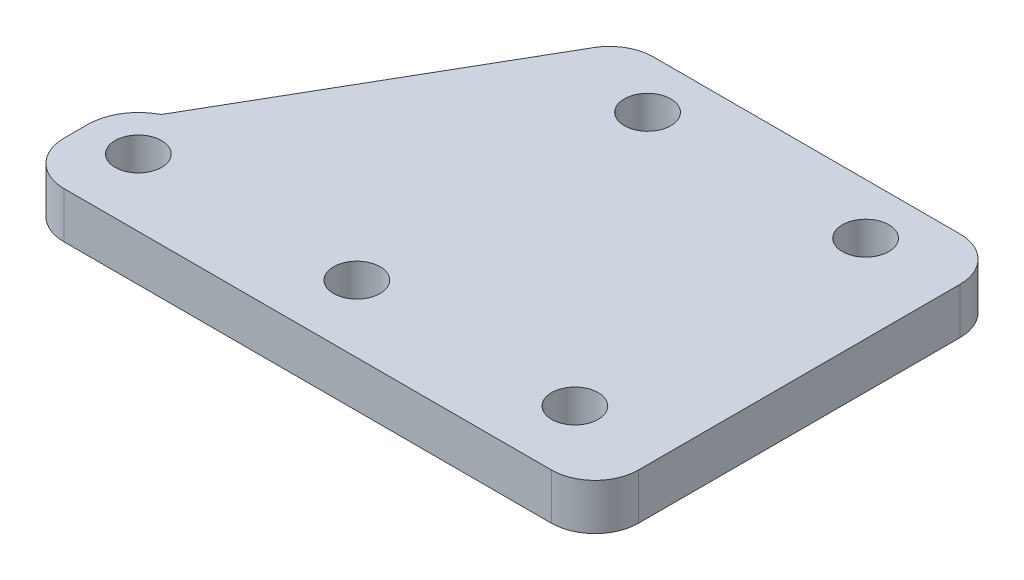
ISO-10303-21;
HEADER;
FILE_DESCRIPTION(('STEP AP214'),'2;1');
FILE_NAME('part.step','',(''),(''),'','','');
FILE_SCHEMA(('AUTOMOTIVE_DESIGN { 1 0 10303 214 1 1 1 1 }'));
ENDSEC;
DATA;
#1=APPLICATION_CONTEXT('core data for automotive mechanical design processes');
#2=APPLICATION_PROTOCOL_DEFINITION('international standard','automotive_design',2000,#1);
#3=PRODUCT_CONTEXT('',#1,'mechanical');
#4=PRODUCT('Part','Part','',(#3));
#5=PRODUCT_RELATED_PRODUCT_CATEGORY('part','',(#4));
#6=PRODUCT_DEFINITION_FORMATION('','',#4);
#7=PRODUCT_DEFINITION_CONTEXT('part definition',#1,'design');
#8=PRODUCT_DEFINITION('design','',#6,#7);
#9=PRODUCT_DEFINITION_SHAPE('','',#8);
#10=(LENGTH_UNIT() NAMED_UNIT(*) SI_UNIT(.MILLI.,.METRE.));
#11=(NAMED_UNIT(*) PLANE_ANGLE_UNIT() SI_UNIT($,.RADIAN.));
#12=(NAMED_UNIT(*) SI_UNIT($,.STERADIAN.) SOLID_ANGLE_UNIT());
#13=UNCERTAINTY_MEASURE_WITH_UNIT(LENGTH_MEASURE(1.E-05),#10,'distance_accuracy_value','');
#14=(GEOMETRIC_REPRESENTATION_CONTEXT(3) GLOBAL_UNCERTAINTY_ASSIGNED_CONTEXT((#13)) GLOBAL_UNIT_ASSIGNED_CONTEXT((#10,
#11,#12)) REPRESENTATION_CONTEXT('',''));
#15=CARTESIAN_POINT('',(0.,0.,0.));
#16=DIRECTION('',(0.,0.,1.));
#17=DIRECTION('',(1.,0.,0.));
#18=AXIS2_PLACEMENT_3D('',#15,#16,#17);
#19=CARTESIAN_POINT('',(-24.4672147191128,9.225,6.49807795643392));
#20=DIRECTION('',(0.,1.,0.));
#21=DIRECTION('',(0.,0.,1.));
#22=AXIS2_PLACEMENT_3D('',#19,#20,#21);
#23=PLANE('',#22);
#24=CARTESIAN_POINT('',(7.5,9.225,-10.));
#25=DIRECTION('',(0.,1.,0.));
#26=DIRECTION('',(0.,0.,1.));
#27=AXIS2_PLACEMENT_3D('',#24,#25,#26);
#28=CIRCLE('',#27,1.59999999999999);
#29=CARTESIAN_POINT('',(7.5,9.225,-8.40000000000001));
#30=VERTEX_POINT('',#29);
#31=EDGE_CURVE('E284',#30,#30,#28,.T.);
#32=ORIENTED_EDGE('',*,*,#31,.F.);
#33=EDGE_LOOP('',(#32));
#34=FACE_BOUND('',#33,.T.);
#35=CARTESIAN_POINT('',(-7.5,9.225,10.));
#36=DIRECTION('',(0.,1.,0.));
#37=DIRECTION('',(0.,0.,1.));
#38=AXIS2_PLACEMENT_3D('',#35,#36,#37);
#39=CIRCLE('',#38,1.59999999999999);
#40=CARTESIAN_POINT('',(-7.5,9.225,11.6));
#41=VERTEX_POINT('',#40);
#42=EDGE_CURVE('E296',#41,#41,#39,.T.);
#43=ORIENTED_EDGE('',*,*,#42,.F.);
#44=EDGE_LOOP('',(#43));
#45=FACE_BOUND('',#44,.T.);
#46=CARTESIAN_POINT('',(-24.4672147191128,9.225,6.49807795643392));
#47=DIRECTION('',(0.,-1.,0.));
#48=DIRECTION('',(0.,0.,1.));
#49=AXIS2_PLACEMENT_3D('',#46,#47,#48);
#50=CIRCLE('',#49,0.499999999999998);
#51=CARTESIAN_POINT('',(-24.0342020172206,9.225,6.74807795643392));
#52=VERTEX_POINT('',#51);
#53=CARTESIAN_POINT('',(-24.2255880054359,9.225,6.93581821187968));
#54=VERTEX_POINT('',#53);
#55=EDGE_CURVE('E172',#52,#54,#50,.T.);
#56=ORIENTED_EDGE('',*,*,#55,.T.);
#57=CARTESIAN_POINT('',(-22.5342010096979,9.225,10.));
#58=DIRECTION('',(0.,1.,0.));
#59=DIRECTION('',(0.,0.,1.));
#60=AXIS2_PLACEMENT_3D('',#57,#58,#59);
#61=CIRCLE('',#60,3.5);
#62=CARTESIAN_POINT('',(-26.0342010096979,9.225,10.));
#63=VERTEX_POINT('',#62);
#64=EDGE_CURVE('E105',#54,#63,#61,.T.);
#65=ORIENTED_EDGE('',*,*,#64,.T.);
#66=DIRECTION('',(0.,0.,1.));
#67=VECTOR('',#66,1.);
#68=CARTESIAN_POINT('',(-26.0342010096979,9.225,11.619));
#69=LINE('',#68,#67);
#70=CARTESIAN_POINT('',(-26.0342010096979,9.225,11.619));
#71=VERTEX_POINT('',#70);
#72=EDGE_CURVE('E196',#63,#71,#69,.T.);
#73=ORIENTED_EDGE('',*,*,#72,.T.);
#74=CARTESIAN_POINT('',(-23.0342010096979,9.225,11.619));
#75=DIRECTION('',(0.,1.,0.));
#76=DIRECTION('',(0.,0.,1.));
#77=AXIS2_PLACEMENT_3D('',#74,#75,#76);
#78=CIRCLE('',#77,3.);
#79=CARTESIAN_POINT('',(-23.0342010096979,9.225,14.619));
#80=VERTEX_POINT('',#79);
#81=EDGE_CURVE('E215',#71,#80,#78,.T.);
#82=ORIENTED_EDGE('',*,*,#81,.T.);
#83=DIRECTION('',(1.,0.,0.));
#84=VECTOR('',#83,1.);
#85=CARTESIAN_POINT('',(-23.0342010096979,9.225,14.619));
#86=LINE('',#85,#84);
#87=CARTESIAN_POINT('',(10.5,9.225,14.619));
#88=VERTEX_POINT('',#87);
#89=EDGE_CURVE('E212',#80,#88,#86,.T.);
#90=ORIENTED_EDGE('',*,*,#89,.T.);
#91=CARTESIAN_POINT('',(10.5,9.225,11.619));
#92=DIRECTION('',(0.,1.,0.));
#93=DIRECTION('',(0.,0.,1.));
#94=AXIS2_PLACEMENT_3D('',#91,#92,#93);
#95=CIRCLE('',#94,3.);
#96=CARTESIAN_POINT('',(13.5,9.225,11.619));
#97=VERTEX_POINT('',#96);
#98=EDGE_CURVE('E214',#88,#97,#95,.T.);
#99=ORIENTED_EDGE('',*,*,#98,.T.);
#100=DIRECTION('',(0.,0.,-1.));
#101=VECTOR('',#100,1.);
#102=CARTESIAN_POINT('',(13.5,9.225,11.619));
#103=LINE('',#102,#101);
#104=CARTESIAN_POINT('',(13.4999999999999,9.225,-10.5));
#105=VERTEX_POINT('',#104);
#106=EDGE_CURVE('E217',#97,#105,#103,.T.);
#107=ORIENTED_EDGE('',*,*,#106,.T.);
#108=CARTESIAN_POINT('',(10.5,9.225,-10.5));
#109=DIRECTION('',(0.,1.,0.));
#110=DIRECTION('',(0.,0.,1.));
#111=AXIS2_PLACEMENT_3D('',#108,#109,#110);
#112=CIRCLE('',#111,2.99999999999996);
#113=CARTESIAN_POINT('',(10.5,9.225,-13.5));
#114=VERTEX_POINT('',#113);
#115=EDGE_CURVE('E133',#105,#114,#112,.T.);
#116=ORIENTED_EDGE('',*,*,#115,.T.);
#117=DIRECTION('',(-1.,0.,0.));
#118=VECTOR('',#117,1.);
#119=CARTESIAN_POINT('',(10.5,9.225,-13.5));
#120=LINE('',#119,#118);
#121=CARTESIAN_POINT('',(-10.6119179509321,9.225,-13.5));
#122=VERTEX_POINT('',#121);
#123=EDGE_CURVE('E127',#114,#122,#120,.T.);
#124=ORIENTED_EDGE('',*,*,#123,.T.);
#125=CARTESIAN_POINT('',(-10.6119179509321,9.225,-10.5));
#126=DIRECTION('',(0.,1.,0.));
#127=DIRECTION('',(0.,0.,1.));
#128=AXIS2_PLACEMENT_3D('',#125,#126,#127);
#129=CIRCLE('',#128,3.);
#130=CARTESIAN_POINT('',(-13.2099941622855,9.225,-12.));
#131=VERTEX_POINT('',#130);
#132=EDGE_CURVE('E131',#122,#131,#129,.T.);
#133=ORIENTED_EDGE('',*,*,#132,.T.);
#134=DIRECTION('',(-0.499999999999997,0.,0.86602540378444));
#135=VECTOR('',#134,1.);
#136=CARTESIAN_POINT('',(-13.2099941622855,9.225,-12.));
#137=LINE('',#136,#135);
#138=EDGE_CURVE('E53',#131,#52,#137,.T.);
#139=ORIENTED_EDGE('',*,*,#138,.T.);
#140=EDGE_LOOP('',(#56,#65,#73,#82,#90,#99,#107,#116,#124,#133,#139));
#141=FACE_BOUND('',#140,.T.);
#142=CARTESIAN_POINT('',(-22.5342010096979,9.225,10.));
#143=DIRECTION('',(0.,1.,0.));
#144=DIRECTION('',(0.,0.,1.));
#145=AXIS2_PLACEMENT_3D('',#142,#143,#144);
#146=CIRCLE('',#145,1.59999999999999);
#147=CARTESIAN_POINT('',(-22.5342010096979,9.225,11.6));
#148=VERTEX_POINT('',#147);
#149=EDGE_CURVE('E155',#148,#148,#146,.T.);
#150=ORIENTED_EDGE('',*,*,#149,.F.);
#151=EDGE_LOOP('',(#150));
#152=FACE_BOUND('',#151,.T.);
#153=CARTESIAN_POINT('',(7.5,9.225,10.));
#154=DIRECTION('',(0.,1.,0.));
#155=DIRECTION('',(0.,0.,1.));
#156=AXIS2_PLACEMENT_3D('',#153,#154,#155);
#157=CIRCLE('',#156,1.59999999999999);
#158=CARTESIAN_POINT('',(7.5,9.225,11.6));
#159=VERTEX_POINT('',#158);
#160=EDGE_CURVE('E290',#159,#159,#157,.T.);
#161=ORIENTED_EDGE('',*,*,#160,.F.);
#162=EDGE_LOOP('',(#161));
#163=FACE_BOUND('',#162,.T.);
#164=CARTESIAN_POINT('',(-7.5,9.225,-10.));
#165=DIRECTION('',(0.,1.,0.));
#166=DIRECTION('',(0.,0.,1.));
#167=AXIS2_PLACEMENT_3D('',#164,#165,#166);
#168=CIRCLE('',#167,1.59999999999999);
#169=CARTESIAN_POINT('',(-7.5,9.225,-8.40000000000001));
#170=VERTEX_POINT('',#169);
#171=EDGE_CURVE('E275',#170,#170,#168,.T.);
#172=ORIENTED_EDGE('',*,*,#171,.F.);
#173=EDGE_LOOP('',(#172));
#174=FACE_BOUND('',#173,.T.);
#175=ADVANCED_FACE('F36',(#34,#45,#141,#152,#163,#174),#23,.T.);
#176=CARTESIAN_POINT('',(-24.4672147191128,6.05,6.49807795643392));
#177=DIRECTION('',(0.,1.,0.));
#178=DIRECTION('',(0.,0.,1.));
#179=AXIS2_PLACEMENT_3D('',#176,#177,#178);
#180=PLANE('',#179);
#181=CARTESIAN_POINT('',(-24.4672147191128,6.05,6.49807795643392));
#182=DIRECTION('',(0.,-1.,0.));
#183=DIRECTION('',(0.,0.,1.));
#184=AXIS2_PLACEMENT_3D('',#181,#182,#183);
#185=CIRCLE('',#184,0.499999999999998);
#186=CARTESIAN_POINT('',(-24.0342020172206,6.05,6.74807795643392));
#187=VERTEX_POINT('',#186);
#188=CARTESIAN_POINT('',(-24.2255880054359,6.05,6.93581821187968));
#189=VERTEX_POINT('',#188);
#190=EDGE_CURVE('E151',#187,#189,#185,.T.);
#191=ORIENTED_EDGE('',*,*,#190,.F.);
#192=DIRECTION('',(-0.499999999999997,0.,0.86602540378444));
#193=VECTOR('',#192,1.);
#194=CARTESIAN_POINT('',(-13.2099941622855,6.05,-12.));
#195=LINE('',#194,#193);
#196=CARTESIAN_POINT('',(-13.2099941622855,6.05,-12.));
#197=VERTEX_POINT('',#196);
#198=EDGE_CURVE('E97',#197,#187,#195,.T.);
#199=ORIENTED_EDGE('',*,*,#198,.F.);
#200=CARTESIAN_POINT('',(-10.6119179509321,6.05,-10.5));
#201=DIRECTION('',(0.,1.,0.));
#202=DIRECTION('',(0.,0.,1.));
#203=AXIS2_PLACEMENT_3D('',#200,#201,#202);
#204=CIRCLE('',#203,3.);
#205=CARTESIAN_POINT('',(-10.6119179509321,6.05,-13.5));
#206=VERTEX_POINT('',#205);
#207=EDGE_CURVE('E91',#206,#197,#204,.T.);
#208=ORIENTED_EDGE('',*,*,#207,.F.);
#209=DIRECTION('',(-1.,0.,0.));
#210=VECTOR('',#209,1.);
#211=CARTESIAN_POINT('',(10.5,6.05,-13.5));
#212=LINE('',#211,#210);
#213=CARTESIAN_POINT('',(10.5,6.05,-13.5));
#214=VERTEX_POINT('',#213);
#215=EDGE_CURVE('E141',#214,#206,#212,.T.);
#216=ORIENTED_EDGE('',*,*,#215,.F.);
#217=CARTESIAN_POINT('',(10.5,6.05,-10.5));
#218=DIRECTION('',(0.,1.,0.));
#219=DIRECTION('',(0.,0.,1.));
#220=AXIS2_PLACEMENT_3D('',#217,#218,#219);
#221=CIRCLE('',#220,2.99999999999996);
#222=CARTESIAN_POINT('',(13.4999999999999,6.05,-10.5));
#223=VERTEX_POINT('',#222);
#224=EDGE_CURVE('E167',#223,#214,#221,.T.);
#225=ORIENTED_EDGE('',*,*,#224,.F.);
#226=DIRECTION('',(0.,0.,-1.));
#227=VECTOR('',#226,1.);
#228=CARTESIAN_POINT('',(13.5,6.05,11.619));
#229=LINE('',#228,#227);
#230=CARTESIAN_POINT('',(13.5,6.05,11.619));
#231=VERTEX_POINT('',#230);
#232=EDGE_CURVE('E165',#231,#223,#229,.T.);
#233=ORIENTED_EDGE('',*,*,#232,.F.);
#234=CARTESIAN_POINT('',(10.5,6.05,11.619));
#235=DIRECTION('',(0.,1.,0.));
#236=DIRECTION('',(0.,0.,1.));
#237=AXIS2_PLACEMENT_3D('',#234,#235,#236);
#238=CIRCLE('',#237,3.);
#239=CARTESIAN_POINT('',(10.5,6.05,14.619));
#240=VERTEX_POINT('',#239);
#241=EDGE_CURVE('E163',#240,#231,#238,.T.);
#242=ORIENTED_EDGE('',*,*,#241,.F.);
#243=DIRECTION('',(1.,0.,0.));
#244=VECTOR('',#243,1.);
#245=CARTESIAN_POINT('',(-23.0342010096979,6.05,14.619));
#246=LINE('',#245,#244);
#247=CARTESIAN_POINT('',(-23.0342010096979,6.05,14.619));
#248=VERTEX_POINT('',#247);
#249=EDGE_CURVE('E161',#248,#240,#246,.T.);
#250=ORIENTED_EDGE('',*,*,#249,.F.);
#251=CARTESIAN_POINT('',(-23.0342010096979,6.05,11.619));
#252=DIRECTION('',(0.,1.,0.));
#253=DIRECTION('',(0.,0.,1.));
#254=AXIS2_PLACEMENT_3D('',#251,#252,#253);
#255=CIRCLE('',#254,3.);
#256=CARTESIAN_POINT('',(-26.0342010096979,6.05,11.619));
#257=VERTEX_POINT('',#256);
#258=EDGE_CURVE('E159',#257,#248,#255,.T.);
#259=ORIENTED_EDGE('',*,*,#258,.F.);
#260=DIRECTION('',(0.,0.,1.));
#261=VECTOR('',#260,1.);
#262=CARTESIAN_POINT('',(-26.0342010096979,6.05,11.619));
#263=LINE('',#262,#261);
#264=CARTESIAN_POINT('',(-26.0342010096979,6.05,10.));
#265=VERTEX_POINT('',#264);
#266=EDGE_CURVE('E157',#265,#257,#263,.T.);
#267=ORIENTED_EDGE('',*,*,#266,.F.);
#268=CARTESIAN_POINT('',(-22.5342010096979,6.05,10.));
#269=DIRECTION('',(0.,1.,0.));
#270=DIRECTION('',(0.,0.,1.));
#271=AXIS2_PLACEMENT_3D('',#268,#269,#270);
#272=CIRCLE('',#271,3.5);
#273=EDGE_CURVE('E154',#189,#265,#272,.T.);
#274=ORIENTED_EDGE('',*,*,#273,.F.);
#275=EDGE_LOOP('',(#191,#199,#208,#216,#225,#233,#242,#250,#259,#267,#274));
#276=FACE_BOUND('',#275,.T.);
#277=CARTESIAN_POINT('',(-22.5342010096979,6.05,10.));
#278=DIRECTION('',(0.,1.,0.));
#279=DIRECTION('',(0.,0.,1.));
#280=AXIS2_PLACEMENT_3D('',#277,#278,#279);
#281=CIRCLE('',#280,1.59999999999999);
#282=CARTESIAN_POINT('',(-22.5342010096979,6.05,11.6));
#283=VERTEX_POINT('',#282);
#284=EDGE_CURVE('E299',#283,#283,#281,.T.);
#285=ORIENTED_EDGE('',*,*,#284,.T.);
#286=EDGE_LOOP('',(#285));
#287=FACE_BOUND('',#286,.T.);
#288=CARTESIAN_POINT('',(-7.5,6.05,10.));
#289=DIRECTION('',(0.,1.,0.));
#290=DIRECTION('',(0.,0.,1.));
#291=AXIS2_PLACEMENT_3D('',#288,#289,#290);
#292=CIRCLE('',#291,1.59999999999999);
#293=CARTESIAN_POINT('',(-7.5,6.05,11.6));
#294=VERTEX_POINT('',#293);
#295=EDGE_CURVE('E293',#294,#294,#292,.T.);
#296=ORIENTED_EDGE('',*,*,#295,.T.);
#297=EDGE_LOOP('',(#296));
#298=FACE_BOUND('',#297,.T.);
#299=CARTESIAN_POINT('',(7.5,6.05,10.));
#300=DIRECTION('',(0.,1.,0.));
#301=DIRECTION('',(0.,0.,1.));
#302=AXIS2_PLACEMENT_3D('',#299,#300,#301);
#303=CIRCLE('',#302,1.59999999999999);
#304=CARTESIAN_POINT('',(7.5,6.05,11.6));
#305=VERTEX_POINT('',#304);
#306=EDGE_CURVE('E287',#305,#305,#303,.T.);
#307=ORIENTED_EDGE('',*,*,#306,.T.);
#308=EDGE_LOOP('',(#307));
#309=FACE_BOUND('',#308,.T.);
#310=CARTESIAN_POINT('',(7.5,6.05,-10.));
#311=DIRECTION('',(0.,1.,0.));
#312=DIRECTION('',(0.,0.,1.));
#313=AXIS2_PLACEMENT_3D('',#310,#311,#312);
#314=CIRCLE('',#313,1.59999999999999);
#315=CARTESIAN_POINT('',(7.5,6.05,-8.40000000000001));
#316=VERTEX_POINT('',#315);
#317=EDGE_CURVE('E281',#316,#316,#314,.T.);
#318=ORIENTED_EDGE('',*,*,#317,.T.);
#319=EDGE_LOOP('',(#318));
#320=FACE_BOUND('',#319,.T.);
#321=CARTESIAN_POINT('',(-7.5,6.05,-10.));
#322=DIRECTION('',(0.,1.,0.));
#323=DIRECTION('',(0.,0.,1.));
#324=AXIS2_PLACEMENT_3D('',#321,#322,#323);
#325=CIRCLE('',#324,1.59999999999999);
#326=CARTESIAN_POINT('',(-7.5,6.05,-8.40000000000001));
#327=VERTEX_POINT('',#326);
#328=EDGE_CURVE('E278',#327,#327,#325,.T.);
#329=ORIENTED_EDGE('',*,*,#328,.T.);
#330=EDGE_LOOP('',(#329));
#331=FACE_BOUND('',#330,.T.);
#332=ADVANCED_FACE('F200',(#276,#287,#298,#309,#320,#331),#180,.F.);
#333=CARTESIAN_POINT('',(-24.4672147191128,9.225,6.49807795643392));
#334=DIRECTION('',(0.,-1.,0.));
#335=DIRECTION('',(0.,0.,-1.));
#336=AXIS2_PLACEMENT_3D('',#333,#334,#335);
#337=CYLINDRICAL_SURFACE('',#336,0.499999999999998);
#338=ORIENTED_EDGE('',*,*,#190,.T.);
#339=DIRECTION('',(0.,-1.,0.));
#340=VECTOR('',#339,1.);
#341=CARTESIAN_POINT('',(-24.2255880054359,9.225,6.93581821187968));
#342=LINE('',#341,#340);
#343=EDGE_CURVE('E11',#54,#189,#342,.T.);
#344=ORIENTED_EDGE('',*,*,#343,.F.);
#345=ORIENTED_EDGE('',*,*,#55,.F.);
#346=DIRECTION('',(0.,-1.,0.));
#347=VECTOR('',#346,1.);
#348=CARTESIAN_POINT('',(-24.0342020172206,9.225,6.74807795643392));
#349=LINE('',#348,#347);
#350=EDGE_CURVE('E147',#52,#187,#349,.T.);
#351=ORIENTED_EDGE('',*,*,#350,.T.);
#352=EDGE_LOOP('',(#338,#344,#345,#351));
#353=FACE_BOUND('',#352,.T.);
#354=ADVANCED_FACE('F38',(#353),#337,.F.);
#355=CARTESIAN_POINT('',(-22.5342010096979,9.225,10.));
#356=DIRECTION('',(0.,-1.,0.));
#357=DIRECTION('',(0.,0.,-1.));
#358=AXIS2_PLACEMENT_3D('',#355,#356,#357);
#359=CYLINDRICAL_SURFACE('',#358,3.5);
#360=ORIENTED_EDGE('',*,*,#273,.T.);
#361=DIRECTION('',(0.,-1.,0.));
#362=VECTOR('',#361,1.);
#363=CARTESIAN_POINT('',(-26.0342010096979,9.225,10.));
#364=LINE('',#363,#362);
#365=EDGE_CURVE('E45',#63,#265,#364,.T.);
#366=ORIENTED_EDGE('',*,*,#365,.F.);
#367=ORIENTED_EDGE('',*,*,#64,.F.);
#368=ORIENTED_EDGE('',*,*,#343,.T.);
#369=EDGE_LOOP('',(#360,#366,#367,#368));
#370=FACE_BOUND('',#369,.T.);
#371=ADVANCED_FACE('F423',(#370),#359,.T.);
#372=CARTESIAN_POINT('',(-26.0342010096979,9.225,11.619));
#373=DIRECTION('',(1.,0.,0.));
#374=DIRECTION('',(0.,0.,-1.));
#375=AXIS2_PLACEMENT_3D('',#372,#373,#374);
#376=PLANE('',#375);
#377=ORIENTED_EDGE('',*,*,#266,.T.);
#378=DIRECTION('',(0.,-1.,0.));
#379=VECTOR('',#378,1.);
#380=CARTESIAN_POINT('',(-26.0342010096979,9.225,11.619));
#381=LINE('',#380,#379);
#382=EDGE_CURVE('E188',#71,#257,#381,.T.);
#383=ORIENTED_EDGE('',*,*,#382,.F.);
#384=ORIENTED_EDGE('',*,*,#72,.F.);
#385=ORIENTED_EDGE('',*,*,#365,.T.);
#386=EDGE_LOOP('',(#377,#383,#384,#385));
#387=FACE_BOUND('',#386,.T.);
#388=ADVANCED_FACE('F194',(#387),#376,.F.);
#389=CARTESIAN_POINT('',(-23.0342010096979,9.225,11.619));
#390=DIRECTION('',(0.,-1.,0.));
#391=DIRECTION('',(0.,0.,-1.));
#392=AXIS2_PLACEMENT_3D('',#389,#390,#391);
#393=CYLINDRICAL_SURFACE('',#392,3.);
#394=ORIENTED_EDGE('',*,*,#258,.T.);
#395=DIRECTION('',(0.,-1.,0.));
#396=VECTOR('',#395,1.);
#397=CARTESIAN_POINT('',(-23.0342010096979,9.225,14.619));
#398=LINE('',#397,#396);
#399=EDGE_CURVE('E185',#80,#248,#398,.T.);
#400=ORIENTED_EDGE('',*,*,#399,.F.);
#401=ORIENTED_EDGE('',*,*,#81,.F.);
#402=ORIENTED_EDGE('',*,*,#382,.T.);
#403=EDGE_LOOP('',(#394,#400,#401,#402));
#404=FACE_BOUND('',#403,.T.);
#405=ADVANCED_FACE('F206',(#404),#393,.T.);
#406=CARTESIAN_POINT('',(-23.0342010096979,9.225,14.619));
#407=DIRECTION('',(0.,0.,-1.));
#408=DIRECTION('',(-1.,0.,0.));
#409=AXIS2_PLACEMENT_3D('',#406,#407,#408);
#410=PLANE('',#409);
#411=ORIENTED_EDGE('',*,*,#249,.T.);
#412=DIRECTION('',(0.,-1.,0.));
#413=VECTOR('',#412,1.);
#414=CARTESIAN_POINT('',(10.5,9.225,14.619));
#415=LINE('',#414,#413);
#416=EDGE_CURVE('E182',#88,#240,#415,.T.);
#417=ORIENTED_EDGE('',*,*,#416,.F.);
#418=ORIENTED_EDGE('',*,*,#89,.F.);
#419=ORIENTED_EDGE('',*,*,#399,.T.);
#420=EDGE_LOOP('',(#411,#417,#418,#419));
#421=FACE_BOUND('',#420,.T.);
#422=ADVANCED_FACE('F210',(#421),#410,.F.);
#423=CARTESIAN_POINT('',(10.5,9.225,11.619));
#424=DIRECTION('',(0.,-1.,0.));
#425=DIRECTION('',(0.,0.,-1.));
#426=AXIS2_PLACEMENT_3D('',#423,#424,#425);
#427=CYLINDRICAL_SURFACE('',#426,3.);
#428=ORIENTED_EDGE('',*,*,#241,.T.);
#429=DIRECTION('',(0.,-1.,0.));
#430=VECTOR('',#429,1.);
#431=CARTESIAN_POINT('',(13.5,9.225,11.619));
#432=LINE('',#431,#430);
#433=EDGE_CURVE('E179',#97,#231,#432,.T.);
#434=ORIENTED_EDGE('',*,*,#433,.F.);
#435=ORIENTED_EDGE('',*,*,#98,.F.);
#436=ORIENTED_EDGE('',*,*,#416,.T.);
#437=EDGE_LOOP('',(#428,#434,#435,#436));
#438=FACE_BOUND('',#437,.T.);
#439=ADVANCED_FACE('F385',(#438),#427,.T.);
#440=CARTESIAN_POINT('',(13.5,9.225,11.619));
#441=DIRECTION('',(-1.,0.,0.));
#442=DIRECTION('',(0.,0.,1.));
#443=AXIS2_PLACEMENT_3D('',#440,#441,#442);
#444=PLANE('',#443);
#445=ORIENTED_EDGE('',*,*,#232,.T.);
#446=DIRECTION('',(0.,-1.,0.));
#447=VECTOR('',#446,1.);
#448=CARTESIAN_POINT('',(13.4999999999999,9.225,-10.5));
#449=LINE('',#448,#447);
#450=EDGE_CURVE('E176',#105,#223,#449,.T.);
#451=ORIENTED_EDGE('',*,*,#450,.F.);
#452=ORIENTED_EDGE('',*,*,#106,.F.);
#453=ORIENTED_EDGE('',*,*,#433,.T.);
#454=EDGE_LOOP('',(#445,#451,#452,#453));
#455=FACE_BOUND('',#454,.T.);
#456=ADVANCED_FACE('F226',(#455),#444,.F.);
#457=CARTESIAN_POINT('',(10.5,9.225,-10.5));
#458=DIRECTION('',(0.,-1.,0.));
#459=DIRECTION('',(0.,0.,-1.));
#460=AXIS2_PLACEMENT_3D('',#457,#458,#459);
#461=CYLINDRICAL_SURFACE('',#460,2.99999999999996);
#462=ORIENTED_EDGE('',*,*,#224,.T.);
#463=DIRECTION('',(0.,-1.,0.));
#464=VECTOR('',#463,1.);
#465=CARTESIAN_POINT('',(10.5,9.225,-13.5));
#466=LINE('',#465,#464);
#467=EDGE_CURVE('E142',#114,#214,#466,.T.);
#468=ORIENTED_EDGE('',*,*,#467,.F.);
#469=ORIENTED_EDGE('',*,*,#115,.F.);
#470=ORIENTED_EDGE('',*,*,#450,.T.);
#471=EDGE_LOOP('',(#462,#468,#469,#470));
#472=FACE_BOUND('',#471,.T.);
#473=ADVANCED_FACE('F230',(#472),#461,.T.);
#474=CARTESIAN_POINT('',(10.5,9.225,-13.5));
#475=DIRECTION('',(0.,0.,1.));
#476=DIRECTION('',(1.,0.,0.));
#477=AXIS2_PLACEMENT_3D('',#474,#475,#476);
#478=PLANE('',#477);
#479=ORIENTED_EDGE('',*,*,#215,.T.);
#480=DIRECTION('',(0.,-1.,0.));
#481=VECTOR('',#480,1.);
#482=CARTESIAN_POINT('',(-10.6119179509321,9.225,-13.5));
#483=LINE('',#482,#481);
#484=EDGE_CURVE('E138',#122,#206,#483,.T.);
#485=ORIENTED_EDGE('',*,*,#484,.F.);
#486=ORIENTED_EDGE('',*,*,#123,.F.);
#487=ORIENTED_EDGE('',*,*,#467,.T.);
#488=EDGE_LOOP('',(#479,#485,#486,#487));
#489=FACE_BOUND('',#488,.T.);
#490=ADVANCED_FACE('F139',(#489),#478,.F.);
#491=CARTESIAN_POINT('',(-10.6119179509321,9.225,-10.5));
#492=DIRECTION('',(0.,-1.,0.));
#493=DIRECTION('',(0.,0.,-1.));
#494=AXIS2_PLACEMENT_3D('',#491,#492,#493);
#495=CYLINDRICAL_SURFACE('',#494,3.);
#496=ORIENTED_EDGE('',*,*,#207,.T.);
#497=DIRECTION('',(0.,-1.,0.));
#498=VECTOR('',#497,1.);
#499=CARTESIAN_POINT('',(-13.2099941622855,9.225,-12.));
#500=LINE('',#499,#498);
#501=EDGE_CURVE('E143',#131,#197,#500,.T.);
#502=ORIENTED_EDGE('',*,*,#501,.F.);
#503=ORIENTED_EDGE('',*,*,#132,.F.);
#504=ORIENTED_EDGE('',*,*,#484,.T.);
#505=EDGE_LOOP('',(#496,#502,#503,#504));
#506=FACE_BOUND('',#505,.T.);
#507=ADVANCED_FACE('F145',(#506),#495,.T.);
#508=CARTESIAN_POINT('',(-13.2099941622855,9.225,-12.));
#509=DIRECTION('',(0.86602540378444,0.,0.499999999999997));
#510=DIRECTION('',(0.499999999999998,0.,-0.86602540378444));
#511=AXIS2_PLACEMENT_3D('',#508,#509,#510);
#512=PLANE('',#511);
#513=ORIENTED_EDGE('',*,*,#198,.T.);
#514=ORIENTED_EDGE('',*,*,#350,.F.);
#515=ORIENTED_EDGE('',*,*,#138,.F.);
#516=ORIENTED_EDGE('',*,*,#501,.T.);
#517=EDGE_LOOP('',(#513,#514,#515,#516));
#518=FACE_BOUND('',#517,.T.);
#519=ADVANCED_FACE('F234',(#518),#512,.F.);
#520=CARTESIAN_POINT('',(-22.5342010096979,9.225,10.));
#521=DIRECTION('',(0.,-1.,0.));
#522=DIRECTION('',(0.,0.,-1.));
#523=AXIS2_PLACEMENT_3D('',#520,#521,#522);
#524=CYLINDRICAL_SURFACE('',#523,1.59999999999999);
#525=ORIENTED_EDGE('',*,*,#149,.T.);
#526=EDGE_LOOP('',(#525));
#527=FACE_BOUND('',#526,.T.);
#528=ORIENTED_EDGE('',*,*,#284,.F.);
#529=EDGE_LOOP('',(#528));
#530=FACE_BOUND('',#529,.T.);
#531=ADVANCED_FACE('F236',(#527,#530),#524,.F.);
#532=CARTESIAN_POINT('',(-7.5,9.225,10.));
#533=DIRECTION('',(0.,-1.,0.));
#534=DIRECTION('',(0.,0.,-1.));
#535=AXIS2_PLACEMENT_3D('',#532,#533,#534);
#536=CYLINDRICAL_SURFACE('',#535,1.59999999999999);
#537=ORIENTED_EDGE('',*,*,#42,.T.);
#538=EDGE_LOOP('',(#537));
#539=FACE_BOUND('',#538,.T.);
#540=ORIENTED_EDGE('',*,*,#295,.F.);
#541=EDGE_LOOP('',(#540));
#542=FACE_BOUND('',#541,.T.);
#543=ADVANCED_FACE('F242',(#539,#542),#536,.F.);
#544=CARTESIAN_POINT('',(7.5,9.225,10.));
#545=DIRECTION('',(0.,-1.,0.));
#546=DIRECTION('',(0.,0.,-1.));
#547=AXIS2_PLACEMENT_3D('',#544,#545,#546);
#548=CYLINDRICAL_SURFACE('',#547,1.59999999999999);
#549=ORIENTED_EDGE('',*,*,#160,.T.);
#550=EDGE_LOOP('',(#549));
#551=FACE_BOUND('',#550,.T.);
#552=ORIENTED_EDGE('',*,*,#306,.F.);
#553=EDGE_LOOP('',(#552));
#554=FACE_BOUND('',#553,.T.);
#555=ADVANCED_FACE('F258',(#551,#554),#548,.F.);
#556=CARTESIAN_POINT('',(7.5,9.225,-10.));
#557=DIRECTION('',(0.,-1.,0.));
#558=DIRECTION('',(0.,0.,-1.));
#559=AXIS2_PLACEMENT_3D('',#556,#557,#558);
#560=CYLINDRICAL_SURFACE('',#559,1.59999999999999);
#561=ORIENTED_EDGE('',*,*,#31,.T.);
#562=EDGE_LOOP('',(#561));
#563=FACE_BOUND('',#562,.T.);
#564=ORIENTED_EDGE('',*,*,#317,.F.);
#565=EDGE_LOOP('',(#564));
#566=FACE_BOUND('',#565,.T.);
#567=ADVANCED_FACE('F262',(#563,#566),#560,.F.);
#568=CARTESIAN_POINT('',(-7.5,9.225,-10.));
#569=DIRECTION('',(0.,-1.,0.));
#570=DIRECTION('',(0.,0.,-1.));
#571=AXIS2_PLACEMENT_3D('',#568,#569,#570);
#572=CYLINDRICAL_SURFACE('',#571,1.59999999999999);
#573=ORIENTED_EDGE('',*,*,#171,.T.);
#574=EDGE_LOOP('',(#573));
#575=FACE_BOUND('',#574,.T.);
#576=ORIENTED_EDGE('',*,*,#328,.F.);
#577=EDGE_LOOP('',(#576));
#578=FACE_BOUND('',#577,.T.);
#579=ADVANCED_FACE('F266',(#575,#578),#572,.F.);
#580=CLOSED_SHELL('',(#175,#332,#354,#371,#388,#405,#422,#439,#456,#473,#490,#507,#519,#531,
#543,#555,#567,#579));
#581=MANIFOLD_SOLID_BREP('B2',#580);
#582=ADVANCED_BREP_SHAPE_REPRESENTATION('',(#18,#581),#14);
#583=SHAPE_DEFINITION_REPRESENTATION(#9,#582);
ENDSEC;
END-ISO-10303-21;
